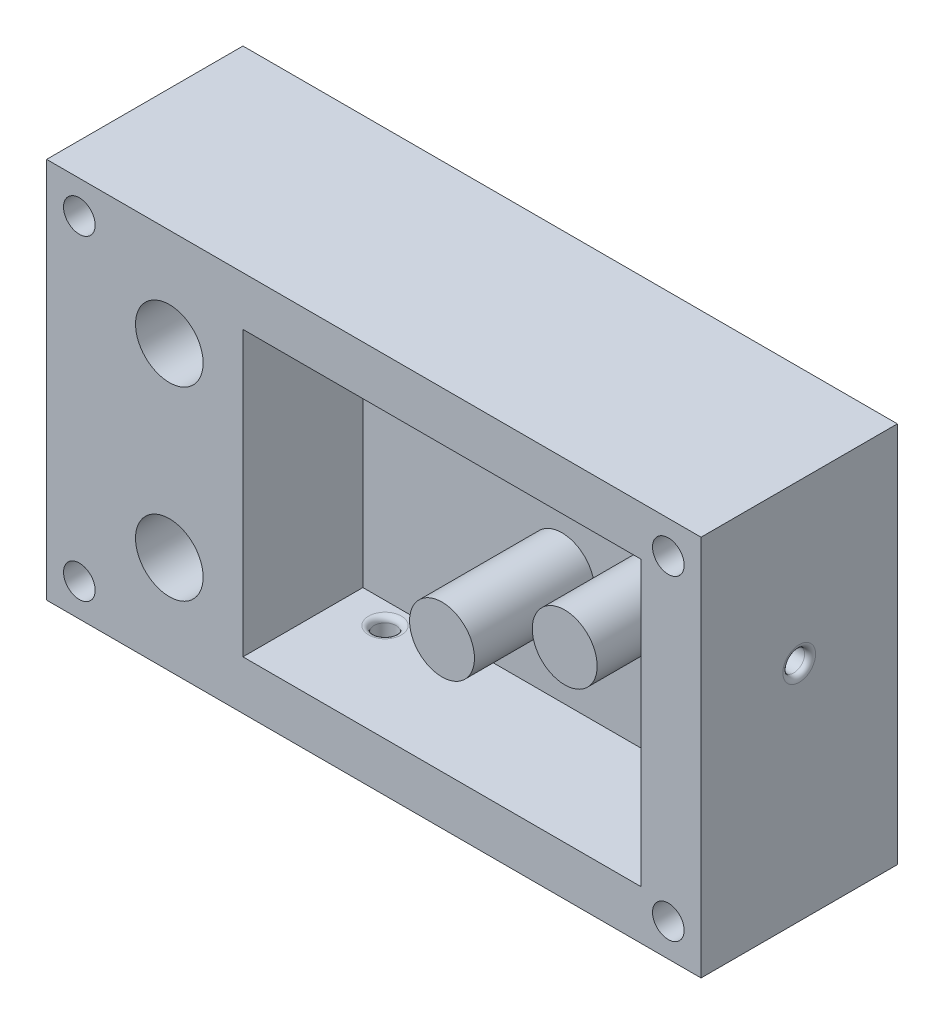
ISO-10303-21;
HEADER;
FILE_DESCRIPTION(('STEP AP214'),'2;1');
FILE_NAME('part.step','',(''),(''),'','','');
FILE_SCHEMA(('AUTOMOTIVE_DESIGN { 1 0 10303 214 1 1 1 1 }'));
ENDSEC;
DATA;
#1=APPLICATION_CONTEXT('core data for automotive mechanical design processes');
#2=APPLICATION_PROTOCOL_DEFINITION('international standard','automotive_design',2000,#1);
#3=PRODUCT_CONTEXT('',#1,'mechanical');
#4=PRODUCT('Part','Part','',(#3));
#5=PRODUCT_RELATED_PRODUCT_CATEGORY('part','',(#4));
#6=PRODUCT_DEFINITION_FORMATION('','',#4);
#7=PRODUCT_DEFINITION_CONTEXT('part definition',#1,'design');
#8=PRODUCT_DEFINITION('design','',#6,#7);
#9=PRODUCT_DEFINITION_SHAPE('','',#8);
#10=(LENGTH_UNIT() NAMED_UNIT(*) SI_UNIT(.MILLI.,.METRE.));
#11=(NAMED_UNIT(*) PLANE_ANGLE_UNIT() SI_UNIT($,.RADIAN.));
#12=(NAMED_UNIT(*) SI_UNIT($,.STERADIAN.) SOLID_ANGLE_UNIT());
#13=UNCERTAINTY_MEASURE_WITH_UNIT(LENGTH_MEASURE(1.E-05),#10,'distance_accuracy_value','');
#14=(GEOMETRIC_REPRESENTATION_CONTEXT(3) GLOBAL_UNCERTAINTY_ASSIGNED_CONTEXT((#13)) GLOBAL_UNIT_ASSIGNED_CONTEXT((#10,
#11,#12)) REPRESENTATION_CONTEXT('',''));
#15=CARTESIAN_POINT('',(0.,0.,0.));
#16=DIRECTION('',(0.,0.,1.));
#17=DIRECTION('',(1.,0.,0.));
#18=AXIS2_PLACEMENT_3D('',#15,#16,#17);
#19=CARTESIAN_POINT('',(0.,35.,18.));
#20=DIRECTION('',(0.,1.,0.));
#21=DIRECTION('',(0.,0.,1.));
#22=AXIS2_PLACEMENT_3D('',#19,#20,#21);
#23=PLANE('',#22);
#24=DIRECTION('',(1.,0.,0.));
#25=VECTOR('',#24,1.);
#26=CARTESIAN_POINT('',(0.,35.,0.));
#27=LINE('',#26,#25);
#28=CARTESIAN_POINT('',(0.,35.,0.));
#29=VERTEX_POINT('',#28);
#30=CARTESIAN_POINT('',(60.,35.,0.));
#31=VERTEX_POINT('',#30);
#32=EDGE_CURVE('E163',#29,#31,#27,.T.);
#33=ORIENTED_EDGE('',*,*,#32,.F.);
#34=DIRECTION('',(0.,0.,-1.));
#35=VECTOR('',#34,1.);
#36=CARTESIAN_POINT('',(0.,35.,18.));
#37=LINE('',#36,#35);
#38=CARTESIAN_POINT('',(0.,35.,18.));
#39=VERTEX_POINT('',#38);
#40=EDGE_CURVE('E63',#39,#29,#37,.T.);
#41=ORIENTED_EDGE('',*,*,#40,.F.);
#42=DIRECTION('',(1.,0.,0.));
#43=VECTOR('',#42,1.);
#44=CARTESIAN_POINT('',(0.,35.,18.));
#45=LINE('',#44,#43);
#46=CARTESIAN_POINT('',(60.,35.,18.));
#47=VERTEX_POINT('',#46);
#48=EDGE_CURVE('E172',#39,#47,#45,.T.);
#49=ORIENTED_EDGE('',*,*,#48,.T.);
#50=DIRECTION('',(0.,0.,-1.));
#51=VECTOR('',#50,1.);
#52=CARTESIAN_POINT('',(60.,35.,18.));
#53=LINE('',#52,#51);
#54=EDGE_CURVE('E180',#47,#31,#53,.T.);
#55=ORIENTED_EDGE('',*,*,#54,.T.);
#56=EDGE_LOOP('',(#33,#41,#49,#55));
#57=FACE_BOUND('',#56,.T.);
#58=ADVANCED_FACE('F39',(#57),#23,.T.);
#59=CARTESIAN_POINT('',(0.,0.,18.));
#60=DIRECTION('',(-1.,0.,0.));
#61=DIRECTION('',(0.,0.,1.));
#62=AXIS2_PLACEMENT_3D('',#59,#60,#61);
#63=PLANE('',#62);
#64=DIRECTION('',(0.,1.,0.));
#65=VECTOR('',#64,1.);
#66=CARTESIAN_POINT('',(0.,0.,0.));
#67=LINE('',#66,#65);
#68=CARTESIAN_POINT('',(0.,0.,0.));
#69=VERTEX_POINT('',#68);
#70=EDGE_CURVE('E174',#69,#29,#67,.T.);
#71=ORIENTED_EDGE('',*,*,#70,.F.);
#72=DIRECTION('',(0.,0.,-1.));
#73=VECTOR('',#72,1.);
#74=CARTESIAN_POINT('',(0.,0.,18.));
#75=LINE('',#74,#73);
#76=CARTESIAN_POINT('',(0.,0.,18.));
#77=VERTEX_POINT('',#76);
#78=EDGE_CURVE('E192',#77,#69,#75,.T.);
#79=ORIENTED_EDGE('',*,*,#78,.F.);
#80=DIRECTION('',(0.,1.,0.));
#81=VECTOR('',#80,1.);
#82=CARTESIAN_POINT('',(0.,0.,18.));
#83=LINE('',#82,#81);
#84=EDGE_CURVE('E178',#77,#39,#83,.T.);
#85=ORIENTED_EDGE('',*,*,#84,.T.);
#86=ORIENTED_EDGE('',*,*,#40,.T.);
#87=EDGE_LOOP('',(#71,#79,#85,#86));
#88=FACE_BOUND('',#87,.T.);
#89=ADVANCED_FACE('F288',(#88),#63,.T.);
#90=CARTESIAN_POINT('',(0.,0.,18.));
#91=DIRECTION('',(0.,1.,0.));
#92=DIRECTION('',(0.,0.,1.));
#93=AXIS2_PLACEMENT_3D('',#90,#91,#92);
#94=PLANE('',#93);
#95=CARTESIAN_POINT('',(22.025,0.,9.));
#96=DIRECTION('',(0.,1.,0.));
#97=DIRECTION('',(0.,0.,1.));
#98=AXIS2_PLACEMENT_3D('',#95,#96,#97);
#99=CIRCLE('',#98,1.5);
#100=CARTESIAN_POINT('',(22.025,0.,10.5));
#101=VERTEX_POINT('',#100);
#102=EDGE_CURVE('E11',#101,#101,#99,.T.);
#103=ORIENTED_EDGE('',*,*,#102,.T.);
#104=EDGE_LOOP('',(#103));
#105=FACE_BOUND('',#104,.T.);
#106=DIRECTION('',(1.,0.,0.));
#107=VECTOR('',#106,1.);
#108=CARTESIAN_POINT('',(0.,0.,0.));
#109=LINE('',#108,#107);
#110=CARTESIAN_POINT('',(60.,0.,0.));
#111=VERTEX_POINT('',#110);
#112=EDGE_CURVE('E186',#69,#111,#109,.T.);
#113=ORIENTED_EDGE('',*,*,#112,.T.);
#114=DIRECTION('',(0.,0.,-1.));
#115=VECTOR('',#114,1.);
#116=CARTESIAN_POINT('',(60.,0.,18.));
#117=LINE('',#116,#115);
#118=CARTESIAN_POINT('',(60.,0.,18.));
#119=VERTEX_POINT('',#118);
#120=EDGE_CURVE('E194',#119,#111,#117,.T.);
#121=ORIENTED_EDGE('',*,*,#120,.F.);
#122=DIRECTION('',(1.,0.,0.));
#123=VECTOR('',#122,1.);
#124=CARTESIAN_POINT('',(0.,0.,18.));
#125=LINE('',#124,#123);
#126=EDGE_CURVE('E176',#77,#119,#125,.T.);
#127=ORIENTED_EDGE('',*,*,#126,.F.);
#128=ORIENTED_EDGE('',*,*,#78,.T.);
#129=EDGE_LOOP('',(#113,#121,#127,#128));
#130=FACE_BOUND('',#129,.T.);
#131=ADVANCED_FACE('F293',(#105,#130),#94,.F.);
#132=CARTESIAN_POINT('',(60.,0.,18.));
#133=DIRECTION('',(-1.,0.,0.));
#134=DIRECTION('',(0.,0.,1.));
#135=AXIS2_PLACEMENT_3D('',#132,#133,#134);
#136=PLANE('',#135);
#137=CARTESIAN_POINT('',(60.,20.475,9.));
#138=DIRECTION('',(-1.,0.,0.));
#139=DIRECTION('',(0.,0.,1.));
#140=AXIS2_PLACEMENT_3D('',#137,#138,#139);
#141=CIRCLE('',#140,1.5);
#142=CARTESIAN_POINT('',(60.,20.475,10.5));
#143=VERTEX_POINT('',#142);
#144=EDGE_CURVE('E209',#143,#143,#141,.T.);
#145=ORIENTED_EDGE('',*,*,#144,.T.);
#146=EDGE_LOOP('',(#145));
#147=FACE_BOUND('',#146,.T.);
#148=DIRECTION('',(0.,1.,0.));
#149=VECTOR('',#148,1.);
#150=CARTESIAN_POINT('',(60.,0.,0.));
#151=LINE('',#150,#149);
#152=EDGE_CURVE('E183',#111,#31,#151,.T.);
#153=ORIENTED_EDGE('',*,*,#152,.T.);
#154=ORIENTED_EDGE('',*,*,#54,.F.);
#155=DIRECTION('',(0.,1.,0.));
#156=VECTOR('',#155,1.);
#157=CARTESIAN_POINT('',(60.,0.,18.));
#158=LINE('',#157,#156);
#159=EDGE_CURVE('E89',#119,#47,#158,.T.);
#160=ORIENTED_EDGE('',*,*,#159,.F.);
#161=ORIENTED_EDGE('',*,*,#120,.T.);
#162=EDGE_LOOP('',(#153,#154,#160,#161));
#163=FACE_BOUND('',#162,.T.);
#164=ADVANCED_FACE('F297',(#147,#163),#136,.F.);
#165=CARTESIAN_POINT('',(0.,0.,18.));
#166=DIRECTION('',(0.,0.,1.));
#167=DIRECTION('',(1.,0.,0.));
#168=AXIS2_PLACEMENT_3D('',#165,#166,#167);
#169=PLANE('',#168);
#170=DIRECTION('',(0.,-1.,0.));
#171=VECTOR('',#170,1.);
#172=CARTESIAN_POINT('',(18.,4.5,18.));
#173=LINE('',#172,#171);
#174=CARTESIAN_POINT('',(18.,30.5,18.));
#175=VERTEX_POINT('',#174);
#176=CARTESIAN_POINT('',(18.,4.5,18.));
#177=VERTEX_POINT('',#176);
#178=EDGE_CURVE('E54',#175,#177,#173,.T.);
#179=ORIENTED_EDGE('',*,*,#178,.F.);
#180=DIRECTION('',(-1.,0.,0.));
#181=VECTOR('',#180,1.);
#182=CARTESIAN_POINT('',(18.,30.5,18.));
#183=LINE('',#182,#181);
#184=CARTESIAN_POINT('',(54.5,30.5,18.));
#185=VERTEX_POINT('',#184);
#186=EDGE_CURVE('E122',#185,#175,#183,.T.);
#187=ORIENTED_EDGE('',*,*,#186,.F.);
#188=DIRECTION('',(0.,1.,0.));
#189=VECTOR('',#188,1.);
#190=CARTESIAN_POINT('',(54.5,4.5,18.));
#191=LINE('',#190,#189);
#192=CARTESIAN_POINT('',(54.5,4.5,18.));
#193=VERTEX_POINT('',#192);
#194=EDGE_CURVE('E127',#193,#185,#191,.T.);
#195=ORIENTED_EDGE('',*,*,#194,.F.);
#196=DIRECTION('',(1.,0.,0.));
#197=VECTOR('',#196,1.);
#198=CARTESIAN_POINT('',(18.,4.5,18.));
#199=LINE('',#198,#197);
#200=EDGE_CURVE('E133',#177,#193,#199,.T.);
#201=ORIENTED_EDGE('',*,*,#200,.F.);
#202=EDGE_LOOP('',(#179,#187,#195,#201));
#203=FACE_BOUND('',#202,.T.);
#204=CARTESIAN_POINT('',(3.,3.,18.));
#205=DIRECTION('',(0.,0.,1.));
#206=DIRECTION('',(1.,0.,0.));
#207=AXIS2_PLACEMENT_3D('',#204,#205,#206);
#208=CIRCLE('',#207,1.45);
#209=CARTESIAN_POINT('',(4.45,3.,18.));
#210=VERTEX_POINT('',#209);
#211=EDGE_CURVE('E137',#210,#210,#208,.T.);
#212=ORIENTED_EDGE('',*,*,#211,.F.);
#213=EDGE_LOOP('',(#212));
#214=FACE_BOUND('',#213,.T.);
#215=CARTESIAN_POINT('',(57.,3.,18.));
#216=DIRECTION('',(0.,0.,1.));
#217=DIRECTION('',(1.,0.,0.));
#218=AXIS2_PLACEMENT_3D('',#215,#216,#217);
#219=CIRCLE('',#218,1.45);
#220=CARTESIAN_POINT('',(58.45,3.,18.));
#221=VERTEX_POINT('',#220);
#222=EDGE_CURVE('E251',#221,#221,#219,.T.);
#223=ORIENTED_EDGE('',*,*,#222,.F.);
#224=EDGE_LOOP('',(#223));
#225=FACE_BOUND('',#224,.T.);
#226=CARTESIAN_POINT('',(57.,32.,18.));
#227=DIRECTION('',(0.,0.,1.));
#228=DIRECTION('',(1.,0.,0.));
#229=AXIS2_PLACEMENT_3D('',#226,#227,#228);
#230=CIRCLE('',#229,1.45);
#231=CARTESIAN_POINT('',(58.45,32.,18.));
#232=VERTEX_POINT('',#231);
#233=EDGE_CURVE('E159',#232,#232,#230,.T.);
#234=ORIENTED_EDGE('',*,*,#233,.F.);
#235=EDGE_LOOP('',(#234));
#236=FACE_BOUND('',#235,.T.);
#237=CARTESIAN_POINT('',(3.,32.,18.));
#238=DIRECTION('',(0.,0.,1.));
#239=DIRECTION('',(1.,0.,0.));
#240=AXIS2_PLACEMENT_3D('',#237,#238,#239);
#241=CIRCLE('',#240,1.45);
#242=CARTESIAN_POINT('',(4.45,32.,18.));
#243=VERTEX_POINT('',#242);
#244=EDGE_CURVE('E156',#243,#243,#241,.T.);
#245=ORIENTED_EDGE('',*,*,#244,.F.);
#246=EDGE_LOOP('',(#245));
#247=FACE_BOUND('',#246,.T.);
#248=CARTESIAN_POINT('',(11.25,26.,18.));
#249=DIRECTION('',(0.,0.,1.));
#250=DIRECTION('',(1.,0.,0.));
#251=AXIS2_PLACEMENT_3D('',#248,#249,#250);
#252=CIRCLE('',#251,3.1);
#253=CARTESIAN_POINT('',(14.35,26.,18.));
#254=VERTEX_POINT('',#253);
#255=EDGE_CURVE('E164',#254,#254,#252,.T.);
#256=ORIENTED_EDGE('',*,*,#255,.F.);
#257=EDGE_LOOP('',(#256));
#258=FACE_BOUND('',#257,.T.);
#259=CARTESIAN_POINT('',(11.25,9.,18.));
#260=DIRECTION('',(0.,0.,1.));
#261=DIRECTION('',(1.,0.,0.));
#262=AXIS2_PLACEMENT_3D('',#259,#260,#261);
#263=CIRCLE('',#262,3.1);
#264=CARTESIAN_POINT('',(14.35,9.,18.));
#265=VERTEX_POINT('',#264);
#266=EDGE_CURVE('E167',#265,#265,#263,.T.);
#267=ORIENTED_EDGE('',*,*,#266,.F.);
#268=EDGE_LOOP('',(#267));
#269=FACE_BOUND('',#268,.T.);
#270=ORIENTED_EDGE('',*,*,#48,.F.);
#271=ORIENTED_EDGE('',*,*,#84,.F.);
#272=ORIENTED_EDGE('',*,*,#126,.T.);
#273=ORIENTED_EDGE('',*,*,#159,.T.);
#274=EDGE_LOOP('',(#270,#271,#272,#273));
#275=FACE_BOUND('',#274,.T.);
#276=ADVANCED_FACE('F130',(#203,#214,#225,#236,#247,#258,#269,#275),#169,.T.);
#277=CARTESIAN_POINT('',(0.,0.,0.));
#278=DIRECTION('',(0.,0.,1.));
#279=DIRECTION('',(1.,0.,0.));
#280=AXIS2_PLACEMENT_3D('',#277,#278,#279);
#281=PLANE('',#280);
#282=CARTESIAN_POINT('',(11.25,26.,0.));
#283=DIRECTION('',(0.,0.,1.));
#284=DIRECTION('',(1.,0.,0.));
#285=AXIS2_PLACEMENT_3D('',#282,#283,#284);
#286=CIRCLE('',#285,3.1);
#287=CARTESIAN_POINT('',(14.35,26.,0.));
#288=VERTEX_POINT('',#287);
#289=EDGE_CURVE('E160',#288,#288,#286,.T.);
#290=ORIENTED_EDGE('',*,*,#289,.T.);
#291=EDGE_LOOP('',(#290));
#292=FACE_BOUND('',#291,.T.);
#293=CARTESIAN_POINT('',(11.25,9.,0.));
#294=DIRECTION('',(0.,0.,1.));
#295=DIRECTION('',(1.,0.,0.));
#296=AXIS2_PLACEMENT_3D('',#293,#294,#295);
#297=CIRCLE('',#296,3.1);
#298=CARTESIAN_POINT('',(14.35,9.,0.));
#299=VERTEX_POINT('',#298);
#300=EDGE_CURVE('E155',#299,#299,#297,.T.);
#301=ORIENTED_EDGE('',*,*,#300,.T.);
#302=EDGE_LOOP('',(#301));
#303=FACE_BOUND('',#302,.T.);
#304=ORIENTED_EDGE('',*,*,#32,.T.);
#305=ORIENTED_EDGE('',*,*,#152,.F.);
#306=ORIENTED_EDGE('',*,*,#112,.F.);
#307=ORIENTED_EDGE('',*,*,#70,.T.);
#308=EDGE_LOOP('',(#304,#305,#306,#307));
#309=FACE_BOUND('',#308,.T.);
#310=ADVANCED_FACE('F563',(#292,#303,#309),#281,.F.);
#311=CARTESIAN_POINT('',(11.25,9.,0.));
#312=DIRECTION('',(0.,0.,1.));
#313=DIRECTION('',(1.,0.,0.));
#314=AXIS2_PLACEMENT_3D('',#311,#312,#313);
#315=CYLINDRICAL_SURFACE('',#314,3.1);
#316=ORIENTED_EDGE('',*,*,#300,.F.);
#317=EDGE_LOOP('',(#316));
#318=FACE_BOUND('',#317,.T.);
#319=ORIENTED_EDGE('',*,*,#266,.T.);
#320=EDGE_LOOP('',(#319));
#321=FACE_BOUND('',#320,.T.);
#322=ADVANCED_FACE('F553',(#318,#321),#315,.F.);
#323=CARTESIAN_POINT('',(11.25,26.,0.));
#324=DIRECTION('',(0.,0.,1.));
#325=DIRECTION('',(1.,0.,0.));
#326=AXIS2_PLACEMENT_3D('',#323,#324,#325);
#327=CYLINDRICAL_SURFACE('',#326,3.1);
#328=ORIENTED_EDGE('',*,*,#289,.F.);
#329=EDGE_LOOP('',(#328));
#330=FACE_BOUND('',#329,.T.);
#331=ORIENTED_EDGE('',*,*,#255,.T.);
#332=EDGE_LOOP('',(#331));
#333=FACE_BOUND('',#332,.T.);
#334=ADVANCED_FACE('F543',(#330,#333),#327,.F.);
#335=CARTESIAN_POINT('',(3.,32.,7.));
#336=DIRECTION('',(0.,0.,1.));
#337=DIRECTION('',(1.,0.,0.));
#338=AXIS2_PLACEMENT_3D('',#335,#336,#337);
#339=CYLINDRICAL_SURFACE('',#338,1.45);
#340=CARTESIAN_POINT('',(3.,32.,7.));
#341=DIRECTION('',(0.,0.,1.));
#342=DIRECTION('',(1.,0.,0.));
#343=AXIS2_PLACEMENT_3D('',#340,#341,#342);
#344=CIRCLE('',#343,1.45);
#345=CARTESIAN_POINT('',(4.45,32.,7.));
#346=VERTEX_POINT('',#345);
#347=EDGE_CURVE('E152',#346,#346,#344,.T.);
#348=ORIENTED_EDGE('',*,*,#347,.F.);
#349=EDGE_LOOP('',(#348));
#350=FACE_BOUND('',#349,.T.);
#351=ORIENTED_EDGE('',*,*,#244,.T.);
#352=EDGE_LOOP('',(#351));
#353=FACE_BOUND('',#352,.T.);
#354=ADVANCED_FACE('F533',(#350,#353),#339,.F.);
#355=CARTESIAN_POINT('',(3.,32.,7.));
#356=DIRECTION('',(0.,0.,1.));
#357=DIRECTION('',(1.,0.,0.));
#358=AXIS2_PLACEMENT_3D('',#355,#356,#357);
#359=PLANE('',#358);
#360=ORIENTED_EDGE('',*,*,#347,.T.);
#361=EDGE_LOOP('',(#360));
#362=FACE_BOUND('',#361,.T.);
#363=ADVANCED_FACE('F332',(#362),#359,.T.);
#364=CARTESIAN_POINT('',(57.,32.,7.));
#365=DIRECTION('',(0.,0.,1.));
#366=DIRECTION('',(1.,0.,0.));
#367=AXIS2_PLACEMENT_3D('',#364,#365,#366);
#368=CYLINDRICAL_SURFACE('',#367,1.45);
#369=CARTESIAN_POINT('',(57.,32.,7.));
#370=DIRECTION('',(0.,0.,1.));
#371=DIRECTION('',(1.,0.,0.));
#372=AXIS2_PLACEMENT_3D('',#369,#370,#371);
#373=CIRCLE('',#372,1.45);
#374=CARTESIAN_POINT('',(58.45,32.,7.));
#375=VERTEX_POINT('',#374);
#376=EDGE_CURVE('E254',#375,#375,#373,.T.);
#377=ORIENTED_EDGE('',*,*,#376,.F.);
#378=EDGE_LOOP('',(#377));
#379=FACE_BOUND('',#378,.T.);
#380=ORIENTED_EDGE('',*,*,#233,.T.);
#381=EDGE_LOOP('',(#380));
#382=FACE_BOUND('',#381,.T.);
#383=ADVANCED_FACE('F328',(#379,#382),#368,.F.);
#384=CARTESIAN_POINT('',(57.,32.,7.));
#385=DIRECTION('',(0.,0.,1.));
#386=DIRECTION('',(1.,0.,0.));
#387=AXIS2_PLACEMENT_3D('',#384,#385,#386);
#388=PLANE('',#387);
#389=ORIENTED_EDGE('',*,*,#376,.T.);
#390=EDGE_LOOP('',(#389));
#391=FACE_BOUND('',#390,.T.);
#392=ADVANCED_FACE('F331',(#391),#388,.T.);
#393=CARTESIAN_POINT('',(57.,3.,7.));
#394=DIRECTION('',(0.,0.,1.));
#395=DIRECTION('',(1.,0.,0.));
#396=AXIS2_PLACEMENT_3D('',#393,#394,#395);
#397=CYLINDRICAL_SURFACE('',#396,1.45);
#398=CARTESIAN_POINT('',(57.,3.,7.));
#399=DIRECTION('',(0.,0.,1.));
#400=DIRECTION('',(1.,0.,0.));
#401=AXIS2_PLACEMENT_3D('',#398,#399,#400);
#402=CIRCLE('',#401,1.45);
#403=CARTESIAN_POINT('',(58.45,3.,7.));
#404=VERTEX_POINT('',#403);
#405=EDGE_CURVE('E248',#404,#404,#402,.T.);
#406=ORIENTED_EDGE('',*,*,#405,.F.);
#407=EDGE_LOOP('',(#406));
#408=FACE_BOUND('',#407,.T.);
#409=ORIENTED_EDGE('',*,*,#222,.T.);
#410=EDGE_LOOP('',(#409));
#411=FACE_BOUND('',#410,.T.);
#412=ADVANCED_FACE('F336',(#408,#411),#397,.F.);
#413=CARTESIAN_POINT('',(57.,3.,7.));
#414=DIRECTION('',(0.,0.,1.));
#415=DIRECTION('',(1.,0.,0.));
#416=AXIS2_PLACEMENT_3D('',#413,#414,#415);
#417=PLANE('',#416);
#418=ORIENTED_EDGE('',*,*,#405,.T.);
#419=EDGE_LOOP('',(#418));
#420=FACE_BOUND('',#419,.T.);
#421=ADVANCED_FACE('F340',(#420),#417,.T.);
#422=CARTESIAN_POINT('',(3.,3.,7.));
#423=DIRECTION('',(0.,0.,1.));
#424=DIRECTION('',(1.,0.,0.));
#425=AXIS2_PLACEMENT_3D('',#422,#423,#424);
#426=CYLINDRICAL_SURFACE('',#425,1.45);
#427=CARTESIAN_POINT('',(3.,3.,7.));
#428=DIRECTION('',(0.,0.,1.));
#429=DIRECTION('',(1.,0.,0.));
#430=AXIS2_PLACEMENT_3D('',#427,#428,#429);
#431=CIRCLE('',#430,1.45);
#432=CARTESIAN_POINT('',(4.45,3.,7.));
#433=VERTEX_POINT('',#432);
#434=EDGE_CURVE('E134',#433,#433,#431,.T.);
#435=ORIENTED_EDGE('',*,*,#434,.F.);
#436=EDGE_LOOP('',(#435));
#437=FACE_BOUND('',#436,.T.);
#438=ORIENTED_EDGE('',*,*,#211,.T.);
#439=EDGE_LOOP('',(#438));
#440=FACE_BOUND('',#439,.T.);
#441=ADVANCED_FACE('F344',(#437,#440),#426,.F.);
#442=CARTESIAN_POINT('',(3.,3.,7.));
#443=DIRECTION('',(0.,0.,1.));
#444=DIRECTION('',(1.,0.,0.));
#445=AXIS2_PLACEMENT_3D('',#442,#443,#444);
#446=PLANE('',#445);
#447=ORIENTED_EDGE('',*,*,#434,.T.);
#448=EDGE_LOOP('',(#447));
#449=FACE_BOUND('',#448,.T.);
#450=ADVANCED_FACE('F348',(#449),#446,.T.);
#451=CARTESIAN_POINT('',(18.,4.5,7.));
#452=DIRECTION('',(-1.,0.,0.));
#453=DIRECTION('',(0.,0.,1.));
#454=AXIS2_PLACEMENT_3D('',#451,#452,#453);
#455=PLANE('',#454);
#456=ORIENTED_EDGE('',*,*,#178,.T.);
#457=DIRECTION('',(0.,0.,1.));
#458=VECTOR('',#457,1.);
#459=CARTESIAN_POINT('',(18.,4.5,7.));
#460=LINE('',#459,#458);
#461=CARTESIAN_POINT('',(18.,4.5,7.));
#462=VERTEX_POINT('',#461);
#463=EDGE_CURVE('E145',#462,#177,#460,.T.);
#464=ORIENTED_EDGE('',*,*,#463,.F.);
#465=DIRECTION('',(0.,-1.,0.));
#466=VECTOR('',#465,1.);
#467=CARTESIAN_POINT('',(18.,4.5,7.));
#468=LINE('',#467,#466);
#469=CARTESIAN_POINT('',(18.,30.5,7.));
#470=VERTEX_POINT('',#469);
#471=EDGE_CURVE('E114',#470,#462,#468,.T.);
#472=ORIENTED_EDGE('',*,*,#471,.F.);
#473=DIRECTION('',(0.,0.,1.));
#474=VECTOR('',#473,1.);
#475=CARTESIAN_POINT('',(18.,30.5,7.));
#476=LINE('',#475,#474);
#477=EDGE_CURVE('E110',#470,#175,#476,.T.);
#478=ORIENTED_EDGE('',*,*,#477,.T.);
#479=EDGE_LOOP('',(#456,#464,#472,#478));
#480=FACE_BOUND('',#479,.T.);
#481=ADVANCED_FACE('F112',(#480),#455,.F.);
#482=CARTESIAN_POINT('',(18.,30.5,7.));
#483=DIRECTION('',(0.,1.,0.));
#484=DIRECTION('',(0.,0.,1.));
#485=AXIS2_PLACEMENT_3D('',#482,#483,#484);
#486=PLANE('',#485);
#487=ORIENTED_EDGE('',*,*,#186,.T.);
#488=ORIENTED_EDGE('',*,*,#477,.F.);
#489=DIRECTION('',(-1.,0.,0.));
#490=VECTOR('',#489,1.);
#491=CARTESIAN_POINT('',(18.,30.5,7.));
#492=LINE('',#491,#490);
#493=CARTESIAN_POINT('',(54.5,30.5,7.));
#494=VERTEX_POINT('',#493);
#495=EDGE_CURVE('E142',#494,#470,#492,.T.);
#496=ORIENTED_EDGE('',*,*,#495,.F.);
#497=DIRECTION('',(0.,0.,1.));
#498=VECTOR('',#497,1.);
#499=CARTESIAN_POINT('',(54.5,30.5,7.));
#500=LINE('',#499,#498);
#501=EDGE_CURVE('E118',#494,#185,#500,.T.);
#502=ORIENTED_EDGE('',*,*,#501,.T.);
#503=EDGE_LOOP('',(#487,#488,#496,#502));
#504=FACE_BOUND('',#503,.T.);
#505=ADVANCED_FACE('F123',(#504),#486,.F.);
#506=CARTESIAN_POINT('',(54.5,4.5,7.));
#507=DIRECTION('',(1.,0.,0.));
#508=DIRECTION('',(0.,0.,-1.));
#509=AXIS2_PLACEMENT_3D('',#506,#507,#508);
#510=PLANE('',#509);
#511=CARTESIAN_POINT('',(54.5,20.475,9.));
#512=DIRECTION('',(1.,0.,0.));
#513=DIRECTION('',(0.,0.,-1.));
#514=AXIS2_PLACEMENT_3D('',#511,#512,#513);
#515=CIRCLE('',#514,1.5);
#516=CARTESIAN_POINT('',(54.5,20.475,7.5));
#517=VERTEX_POINT('',#516);
#518=EDGE_CURVE('E212',#517,#517,#515,.T.);
#519=ORIENTED_EDGE('',*,*,#518,.T.);
#520=EDGE_LOOP('',(#519));
#521=FACE_BOUND('',#520,.T.);
#522=ORIENTED_EDGE('',*,*,#194,.T.);
#523=ORIENTED_EDGE('',*,*,#501,.F.);
#524=DIRECTION('',(0.,1.,0.));
#525=VECTOR('',#524,1.);
#526=CARTESIAN_POINT('',(54.5,4.5,7.));
#527=LINE('',#526,#525);
#528=CARTESIAN_POINT('',(54.5,4.5,7.));
#529=VERTEX_POINT('',#528);
#530=EDGE_CURVE('E144',#529,#494,#527,.T.);
#531=ORIENTED_EDGE('',*,*,#530,.F.);
#532=DIRECTION('',(0.,0.,1.));
#533=VECTOR('',#532,1.);
#534=CARTESIAN_POINT('',(54.5,4.5,7.));
#535=LINE('',#534,#533);
#536=EDGE_CURVE('E239',#529,#193,#535,.T.);
#537=ORIENTED_EDGE('',*,*,#536,.T.);
#538=EDGE_LOOP('',(#522,#523,#531,#537));
#539=FACE_BOUND('',#538,.T.);
#540=ADVANCED_FACE('F236',(#521,#539),#510,.F.);
#541=CARTESIAN_POINT('',(18.,4.5,7.));
#542=DIRECTION('',(0.,-1.,0.));
#543=DIRECTION('',(0.,0.,-1.));
#544=AXIS2_PLACEMENT_3D('',#541,#542,#543);
#545=PLANE('',#544);
#546=CARTESIAN_POINT('',(22.025,4.5,9.));
#547=DIRECTION('',(0.,-1.,0.));
#548=DIRECTION('',(0.,0.,-1.));
#549=AXIS2_PLACEMENT_3D('',#546,#547,#548);
#550=CIRCLE('',#549,1.5);
#551=CARTESIAN_POINT('',(22.025,4.5,7.5));
#552=VERTEX_POINT('',#551);
#553=EDGE_CURVE('E215',#552,#552,#550,.T.);
#554=ORIENTED_EDGE('',*,*,#553,.T.);
#555=EDGE_LOOP('',(#554));
#556=FACE_BOUND('',#555,.T.);
#557=ORIENTED_EDGE('',*,*,#200,.T.);
#558=ORIENTED_EDGE('',*,*,#536,.F.);
#559=DIRECTION('',(1.,0.,0.));
#560=VECTOR('',#559,1.);
#561=CARTESIAN_POINT('',(18.,4.5,7.));
#562=LINE('',#561,#560);
#563=EDGE_CURVE('E148',#462,#529,#562,.T.);
#564=ORIENTED_EDGE('',*,*,#563,.F.);
#565=ORIENTED_EDGE('',*,*,#463,.T.);
#566=EDGE_LOOP('',(#557,#558,#564,#565));
#567=FACE_BOUND('',#566,.T.);
#568=ADVANCED_FACE('F232',(#556,#567),#545,.F.);
#569=CARTESIAN_POINT('',(0.,0.,7.));
#570=DIRECTION('',(0.,0.,-1.));
#571=DIRECTION('',(-1.,0.,0.));
#572=AXIS2_PLACEMENT_3D('',#569,#570,#571);
#573=PLANE('',#572);
#574=CARTESIAN_POINT('',(47.5,20.,7.));
#575=DIRECTION('',(0.,0.,-1.));
#576=DIRECTION('',(-1.,0.,0.));
#577=AXIS2_PLACEMENT_3D('',#574,#575,#576);
#578=CIRCLE('',#577,2.975);
#579=CARTESIAN_POINT('',(44.525,20.,7.));
#580=VERTEX_POINT('',#579);
#581=EDGE_CURVE('E200',#580,#580,#578,.F.);
#582=ORIENTED_EDGE('',*,*,#581,.F.);
#583=EDGE_LOOP('',(#582));
#584=FACE_BOUND('',#583,.T.);
#585=CARTESIAN_POINT('',(36.25,15.,7.));
#586=DIRECTION('',(0.,0.,-1.));
#587=DIRECTION('',(-1.,0.,0.));
#588=AXIS2_PLACEMENT_3D('',#585,#586,#587);
#589=CIRCLE('',#588,2.975);
#590=CARTESIAN_POINT('',(33.275,15.,7.));
#591=VERTEX_POINT('',#590);
#592=EDGE_CURVE('E191',#591,#591,#589,.F.);
#593=ORIENTED_EDGE('',*,*,#592,.F.);
#594=EDGE_LOOP('',(#593));
#595=FACE_BOUND('',#594,.T.);
#596=ORIENTED_EDGE('',*,*,#471,.T.);
#597=ORIENTED_EDGE('',*,*,#563,.T.);
#598=ORIENTED_EDGE('',*,*,#530,.T.);
#599=ORIENTED_EDGE('',*,*,#495,.T.);
#600=EDGE_LOOP('',(#596,#597,#598,#599));
#601=FACE_BOUND('',#600,.T.);
#602=ADVANCED_FACE('F235',(#584,#595,#601),#573,.F.);
#603=CARTESIAN_POINT('',(36.25,15.,18.));
#604=DIRECTION('',(0.,0.,-1.));
#605=DIRECTION('',(-1.,0.,0.));
#606=AXIS2_PLACEMENT_3D('',#603,#604,#605);
#607=CYLINDRICAL_SURFACE('',#606,2.975);
#608=CARTESIAN_POINT('',(36.25,15.,18.));
#609=DIRECTION('',(0.,0.,1.));
#610=DIRECTION('',(1.,0.,0.));
#611=AXIS2_PLACEMENT_3D('',#608,#609,#610);
#612=CIRCLE('',#611,2.975);
#613=CARTESIAN_POINT('',(39.225,15.,18.));
#614=VERTEX_POINT('',#613);
#615=EDGE_CURVE('E119',#614,#614,#612,.T.);
#616=ORIENTED_EDGE('',*,*,#615,.F.);
#617=EDGE_LOOP('',(#616));
#618=FACE_BOUND('',#617,.T.);
#619=ORIENTED_EDGE('',*,*,#592,.T.);
#620=EDGE_LOOP('',(#619));
#621=FACE_BOUND('',#620,.T.);
#622=ADVANCED_FACE('F276',(#618,#621),#607,.T.);
#623=CARTESIAN_POINT('',(36.25,15.,18.));
#624=DIRECTION('',(0.,0.,1.));
#625=DIRECTION('',(1.,0.,0.));
#626=AXIS2_PLACEMENT_3D('',#623,#624,#625);
#627=PLANE('',#626);
#628=ORIENTED_EDGE('',*,*,#615,.T.);
#629=EDGE_LOOP('',(#628));
#630=FACE_BOUND('',#629,.T.);
#631=ADVANCED_FACE('F270',(#630),#627,.T.);
#632=CARTESIAN_POINT('',(47.5,20.,18.));
#633=DIRECTION('',(0.,0.,-1.));
#634=DIRECTION('',(-1.,0.,0.));
#635=AXIS2_PLACEMENT_3D('',#632,#633,#634);
#636=CYLINDRICAL_SURFACE('',#635,2.975);
#637=CARTESIAN_POINT('',(47.5,20.,18.));
#638=DIRECTION('',(0.,0.,1.));
#639=DIRECTION('',(1.,0.,0.));
#640=AXIS2_PLACEMENT_3D('',#637,#638,#639);
#641=CIRCLE('',#640,2.975);
#642=CARTESIAN_POINT('',(50.475,20.,18.));
#643=VERTEX_POINT('',#642);
#644=EDGE_CURVE('E261',#643,#643,#641,.T.);
#645=ORIENTED_EDGE('',*,*,#644,.F.);
#646=EDGE_LOOP('',(#645));
#647=FACE_BOUND('',#646,.T.);
#648=ORIENTED_EDGE('',*,*,#581,.T.);
#649=EDGE_LOOP('',(#648));
#650=FACE_BOUND('',#649,.T.);
#651=ADVANCED_FACE('F267',(#647,#650),#636,.T.);
#652=CARTESIAN_POINT('',(47.5,20.,18.));
#653=DIRECTION('',(0.,0.,1.));
#654=DIRECTION('',(1.,0.,0.));
#655=AXIS2_PLACEMENT_3D('',#652,#653,#654);
#656=PLANE('',#655);
#657=ORIENTED_EDGE('',*,*,#644,.T.);
#658=EDGE_LOOP('',(#657));
#659=FACE_BOUND('',#658,.T.);
#660=ADVANCED_FACE('F265',(#659),#656,.T.);
#661=CARTESIAN_POINT('',(54.2,20.475,9.));
#662=DIRECTION('',(1.,0.,0.));
#663=DIRECTION('',(0.,0.,-1.));
#664=AXIS2_PLACEMENT_3D('',#661,#662,#663);
#665=CYLINDRICAL_SURFACE('',#664,1.);
#666=CARTESIAN_POINT('',(59.5,20.475,9.));
#667=DIRECTION('',(-1.,0.,0.));
#668=DIRECTION('',(0.,0.,1.));
#669=AXIS2_PLACEMENT_3D('',#666,#667,#668);
#670=CIRCLE('',#669,1.);
#671=CARTESIAN_POINT('',(59.5,20.475,10.));
#672=VERTEX_POINT('',#671);
#673=EDGE_CURVE('E206',#672,#672,#670,.F.);
#674=ORIENTED_EDGE('',*,*,#673,.T.);
#675=EDGE_LOOP('',(#674));
#676=FACE_BOUND('',#675,.T.);
#677=CARTESIAN_POINT('',(55.,20.475,9.));
#678=DIRECTION('',(1.,0.,0.));
#679=DIRECTION('',(0.,0.,-1.));
#680=AXIS2_PLACEMENT_3D('',#677,#678,#679);
#681=CIRCLE('',#680,1.);
#682=CARTESIAN_POINT('',(55.,20.475,8.));
#683=VERTEX_POINT('',#682);
#684=EDGE_CURVE('E203',#683,#683,#681,.F.);
#685=ORIENTED_EDGE('',*,*,#684,.T.);
#686=EDGE_LOOP('',(#685));
#687=FACE_BOUND('',#686,.T.);
#688=ADVANCED_FACE('F311',(#676,#687),#665,.F.);
#689=CARTESIAN_POINT('',(22.025,5.8,9.));
#690=DIRECTION('',(0.,-1.,0.));
#691=DIRECTION('',(0.,0.,-1.));
#692=AXIS2_PLACEMENT_3D('',#689,#690,#691);
#693=CYLINDRICAL_SURFACE('',#692,1.);
#694=CARTESIAN_POINT('',(22.025,4.,9.));
#695=DIRECTION('',(0.,-1.,0.));
#696=DIRECTION('',(0.,0.,-1.));
#697=AXIS2_PLACEMENT_3D('',#694,#695,#696);
#698=CIRCLE('',#697,1.);
#699=CARTESIAN_POINT('',(22.025,4.,8.));
#700=VERTEX_POINT('',#699);
#701=EDGE_CURVE('E47',#700,#700,#698,.F.);
#702=ORIENTED_EDGE('',*,*,#701,.T.);
#703=EDGE_LOOP('',(#702));
#704=FACE_BOUND('',#703,.T.);
#705=CARTESIAN_POINT('',(22.025,0.5,9.));
#706=DIRECTION('',(0.,1.,0.));
#707=DIRECTION('',(0.,0.,1.));
#708=AXIS2_PLACEMENT_3D('',#705,#706,#707);
#709=CIRCLE('',#708,1.);
#710=CARTESIAN_POINT('',(22.025,0.5,10.));
#711=VERTEX_POINT('',#710);
#712=EDGE_CURVE('E218',#711,#711,#709,.F.);
#713=ORIENTED_EDGE('',*,*,#712,.T.);
#714=EDGE_LOOP('',(#713));
#715=FACE_BOUND('',#714,.T.);
#716=ADVANCED_FACE('F223',(#704,#715),#693,.F.);
#717=CARTESIAN_POINT('',(59.5,20.475,9.));
#718=DIRECTION('',(-1.,0.,0.));
#719=DIRECTION('',(0.,0.,1.));
#720=AXIS2_PLACEMENT_3D('',#717,#718,#719);
#721=TOROIDAL_SURFACE('',#720,1.5,0.5);
#722=ORIENTED_EDGE('',*,*,#144,.F.);
#723=EDGE_LOOP('',(#722));
#724=FACE_BOUND('',#723,.T.);
#725=ORIENTED_EDGE('',*,*,#673,.F.);
#726=EDGE_LOOP('',(#725));
#727=FACE_BOUND('',#726,.T.);
#728=ADVANCED_FACE('F299',(#724,#727),#721,.T.);
#729=CARTESIAN_POINT('',(55.,20.475,9.));
#730=DIRECTION('',(1.,0.,0.));
#731=DIRECTION('',(0.,0.,-1.));
#732=AXIS2_PLACEMENT_3D('',#729,#730,#731);
#733=TOROIDAL_SURFACE('',#732,1.5,0.5);
#734=ORIENTED_EDGE('',*,*,#684,.F.);
#735=EDGE_LOOP('',(#734));
#736=FACE_BOUND('',#735,.T.);
#737=ORIENTED_EDGE('',*,*,#518,.F.);
#738=EDGE_LOOP('',(#737));
#739=FACE_BOUND('',#738,.T.);
#740=ADVANCED_FACE('F229',(#736,#739),#733,.T.);
#741=CARTESIAN_POINT('',(22.025,4.,9.));
#742=DIRECTION('',(0.,-1.,0.));
#743=DIRECTION('',(0.,0.,-1.));
#744=AXIS2_PLACEMENT_3D('',#741,#742,#743);
#745=TOROIDAL_SURFACE('',#744,1.5,0.5);
#746=ORIENTED_EDGE('',*,*,#701,.F.);
#747=EDGE_LOOP('',(#746));
#748=FACE_BOUND('',#747,.T.);
#749=ORIENTED_EDGE('',*,*,#553,.F.);
#750=EDGE_LOOP('',(#749));
#751=FACE_BOUND('',#750,.T.);
#752=ADVANCED_FACE('F226',(#748,#751),#745,.T.);
#753=CARTESIAN_POINT('',(22.025,0.5,9.));
#754=DIRECTION('',(0.,1.,0.));
#755=DIRECTION('',(0.,0.,1.));
#756=AXIS2_PLACEMENT_3D('',#753,#754,#755);
#757=TOROIDAL_SURFACE('',#756,1.5,0.5);
#758=ORIENTED_EDGE('',*,*,#102,.F.);
#759=EDGE_LOOP('',(#758));
#760=FACE_BOUND('',#759,.T.);
#761=ORIENTED_EDGE('',*,*,#712,.F.);
#762=EDGE_LOOP('',(#761));
#763=FACE_BOUND('',#762,.T.);
#764=ADVANCED_FACE('F41',(#760,#763),#757,.T.);
#765=CLOSED_SHELL('',(#58,#89,#131,#164,#276,#310,#322,#334,#354,#363,#383,#392,#412,#421,#441,
#450,#481,#505,#540,#568,#602,#622,#631,#651,#660,#688,#716,#728,#740,#752,#764));
#766=MANIFOLD_SOLID_BREP('B2',#765);
#767=ADVANCED_BREP_SHAPE_REPRESENTATION('',(#18,#766),#14);
#768=SHAPE_DEFINITION_REPRESENTATION(#9,#767);
ENDSEC;
END-ISO-10303-21;
